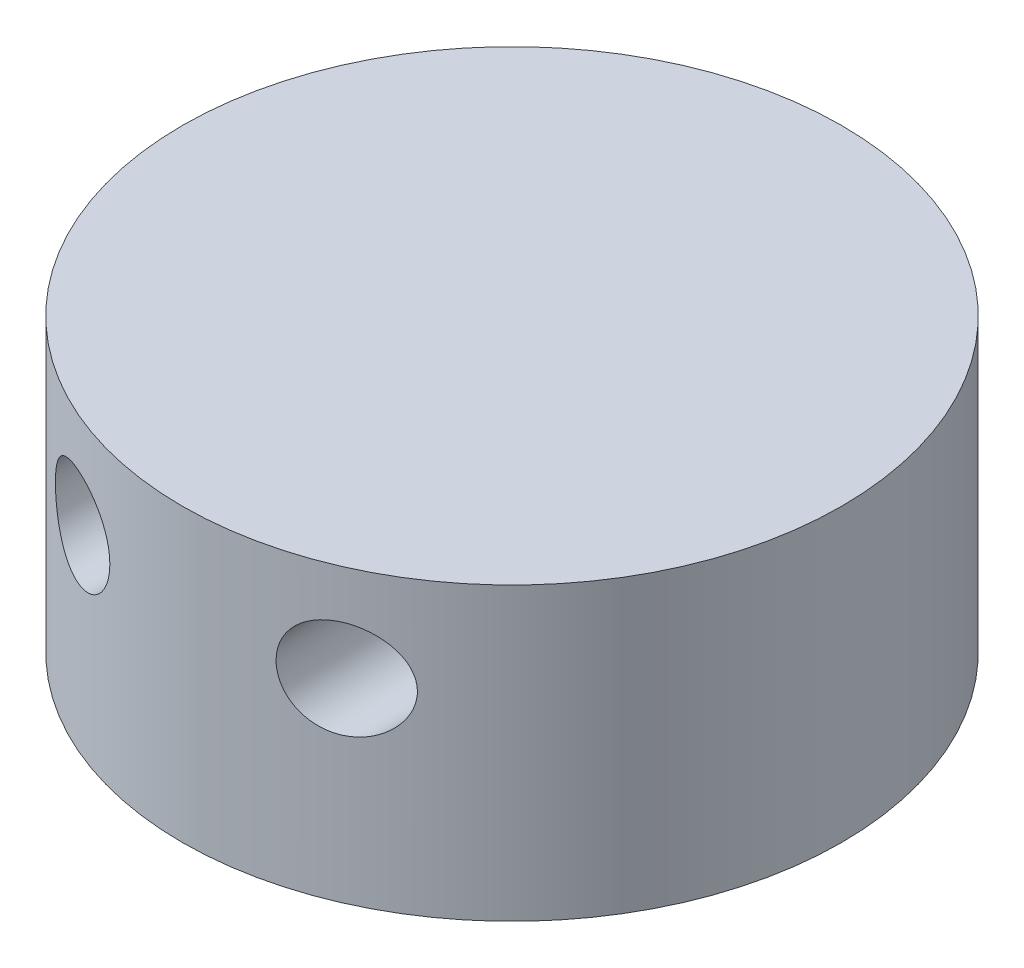
ISO-10303-21;
HEADER;
FILE_DESCRIPTION(('STEP AP214'),'2;1');
FILE_NAME('part.step','',(''),(''),'','','');
FILE_SCHEMA(('AUTOMOTIVE_DESIGN { 1 0 10303 214 1 1 1 1 }'));
ENDSEC;
DATA;
#1=APPLICATION_CONTEXT('core data for automotive mechanical design processes');
#2=APPLICATION_PROTOCOL_DEFINITION('international standard','automotive_design',2000,#1);
#3=PRODUCT_CONTEXT('',#1,'mechanical');
#4=PRODUCT('Part','Part','',(#3));
#5=PRODUCT_RELATED_PRODUCT_CATEGORY('part','',(#4));
#6=PRODUCT_DEFINITION_FORMATION('','',#4);
#7=PRODUCT_DEFINITION_CONTEXT('part definition',#1,'design');
#8=PRODUCT_DEFINITION('design','',#6,#7);
#9=PRODUCT_DEFINITION_SHAPE('','',#8);
#10=(LENGTH_UNIT() NAMED_UNIT(*) SI_UNIT(.MILLI.,.METRE.));
#11=(NAMED_UNIT(*) PLANE_ANGLE_UNIT() SI_UNIT($,.RADIAN.));
#12=(NAMED_UNIT(*) SI_UNIT($,.STERADIAN.) SOLID_ANGLE_UNIT());
#13=UNCERTAINTY_MEASURE_WITH_UNIT(LENGTH_MEASURE(1.E-05),#10,'distance_accuracy_value','');
#14=(GEOMETRIC_REPRESENTATION_CONTEXT(3) GLOBAL_UNCERTAINTY_ASSIGNED_CONTEXT((#13)) GLOBAL_UNIT_ASSIGNED_CONTEXT((#10,
#11,#12)) REPRESENTATION_CONTEXT('',''));
#15=CARTESIAN_POINT('',(0.,0.,0.));
#16=DIRECTION('',(0.,0.,1.));
#17=DIRECTION('',(1.,0.,0.));
#18=AXIS2_PLACEMENT_3D('',#15,#16,#17);
#19=CARTESIAN_POINT('',(0.,-19.05,0.));
#20=DIRECTION('',(0.,1.,0.));
#21=DIRECTION('',(0.,0.,1.));
#22=AXIS2_PLACEMENT_3D('',#19,#20,#21);
#23=CYLINDRICAL_SURFACE('',#22,21.5646);
#24=CARTESIAN_POINT('',(-11.8375244788466,-6.35,-18.0251210085455));
#25=CARTESIAN_POINT('',(-11.8375183473624,-6.51018114216781,-18.0251263162348));
#26=CARTESIAN_POINT('',(-11.8254290880868,-6.6704137015662,-18.0330820790892));
#27=CARTESIAN_POINT('',(-11.7777850103847,-6.98585035433216,-18.0642332893516));
#28=CARTESIAN_POINT('',(-11.7422144072352,-7.14105099144283,-18.0874389880853));
#29=CARTESIAN_POINT('',(-11.6497562099748,-7.44142680818182,-18.1471246719633));
#30=CARTESIAN_POINT('',(-11.5929604920097,-7.5866420488448,-18.1835474256552));
#31=CARTESIAN_POINT('',(-11.4605634840516,-7.86476139569148,-18.2672814389251));
#32=CARTESIAN_POINT('',(-11.3849578630624,-7.99766265688539,-18.3145952059805));
#33=CARTESIAN_POINT('',(-11.2113110386347,-8.25852501951614,-18.421443957742));
#34=CARTESIAN_POINT('',(-11.112019761268,-8.38538430582568,-18.4816260108911));
#35=CARTESIAN_POINT('',(-10.8977010507736,-8.62106980196782,-18.6088051328418));
#36=CARTESIAN_POINT('',(-10.7826665603868,-8.72988787575553,-18.6758052545265));
#37=CARTESIAN_POINT('',(-10.5207943879099,-8.94366894462049,-18.8247399152261));
#38=CARTESIAN_POINT('',(-10.3717849637708,-9.0454806960261,-18.9073888948592));
#39=CARTESIAN_POINT('',(-10.0598907459932,-9.222364217516,-19.0751665797716));
#40=CARTESIAN_POINT('',(-9.89699786600378,-9.29742027016151,-19.1602967109285));
#41=CARTESIAN_POINT('',(-9.54434429888561,-9.42539040894322,-19.3385660089982));
#42=CARTESIAN_POINT('',(-9.35351360338981,-9.47542392867096,-19.4316748642965));
#43=CARTESIAN_POINT('',(-8.9642043947241,-9.53974930770958,-19.6143121251587));
#44=CARTESIAN_POINT('',(-8.76572511354421,-9.55403756822131,-19.7038401693171));
#45=CARTESIAN_POINT('',(-8.36692464727601,-9.54519600880489,-19.8764605483672));
#46=CARTESIAN_POINT('',(-8.16660526111179,-9.5220995207692,-19.9595585470267));
#47=CARTESIAN_POINT('',(-7.77065834449357,-9.43750996116071,-20.117012182636));
#48=CARTESIAN_POINT('',(-7.57502872809517,-9.37603430195839,-20.1913717659769));
#49=CARTESIAN_POINT('',(-7.20927489895007,-9.22062720154446,-20.3247045929858));
#50=CARTESIAN_POINT('',(-7.03832333883191,-9.1292564194137,-20.3843889990063));
#51=CARTESIAN_POINT('',(-6.71361514487239,-8.91523323045435,-20.4936256376209));
#52=CARTESIAN_POINT('',(-6.55985033130298,-8.79259579640629,-20.543182699528));
#53=CARTESIAN_POINT('',(-6.28651512699416,-8.52955728883257,-20.628396044537));
#54=CARTESIAN_POINT('',(-6.16525101480595,-8.39115922178523,-20.6648126910791));
#55=CARTESIAN_POINT('',(-5.94750082426833,-8.09423219136849,-20.7285338223231));
#56=CARTESIAN_POINT('',(-5.85100791629074,-7.93570879477398,-20.7558408192547));
#57=CARTESIAN_POINT('',(-5.69023921086854,-7.61086792469432,-20.8004766181142));
#58=CARTESIAN_POINT('',(-5.62470452053309,-7.44522644209332,-20.818200587112));
#59=CARTESIAN_POINT('',(-5.52192017765209,-7.10476317342352,-20.8457004608132));
#60=CARTESIAN_POINT('',(-5.48466697619415,-6.92994254214792,-20.8554773627679));
#61=CARTESIAN_POINT('',(-5.4401871429484,-6.57964803138163,-20.8671238883316));
#62=CARTESIAN_POINT('',(-5.4324049343745,-6.40424929700857,-20.8691398310516));
#63=CARTESIAN_POINT('',(-5.44558781138506,-6.05461358068219,-20.8657037234144));
#64=CARTESIAN_POINT('',(-5.46655151317064,-5.8803765432117,-20.8602520325415));
#65=CARTESIAN_POINT('',(-5.53635732504388,-5.53879001557082,-20.8418329263995));
#66=CARTESIAN_POINT('',(-5.58507801477574,-5.37141390894487,-20.8288982410085));
#67=CARTESIAN_POINT('',(-5.70865313142634,-5.04743564743358,-20.795367872532));
#68=CARTESIAN_POINT('',(-5.78350725162901,-4.89083336612663,-20.7747722793589));
#69=CARTESIAN_POINT('',(-5.95732890248189,-4.59177881227504,-20.7255971033535));
#70=CARTESIAN_POINT('',(-6.05643512177475,-4.44941480515269,-20.6969714567415));
#71=CARTESIAN_POINT('',(-6.2751760926222,-4.18357489495717,-20.6317020948896));
#72=CARTESIAN_POINT('',(-6.39481183060543,-4.06009990002696,-20.5950579943455));
#73=CARTESIAN_POINT('',(-6.65331568789005,-3.83259832398677,-20.5130223155282));
#74=CARTESIAN_POINT('',(-6.79252779900094,-3.72902233412902,-20.4674668111612));
#75=CARTESIAN_POINT('',(-7.08374016275367,-3.54659145187776,-20.3685109548662));
#76=CARTESIAN_POINT('',(-7.23574252369343,-3.46774064525744,-20.3151093085222));
#77=CARTESIAN_POINT('',(-7.55488028036876,-3.33294608295785,-20.198658965099));
#78=CARTESIAN_POINT('',(-7.72238718335797,-3.27816171262923,-20.1352893791017));
#79=CARTESIAN_POINT('',(-8.06155617263523,-3.19695034675592,-20.0019131242545));
#80=CARTESIAN_POINT('',(-8.23321949760546,-3.17053191379108,-19.9319044582596));
#81=CARTESIAN_POINT('',(-8.58820427667065,-3.14469475758145,-19.7816669652899));
#82=CARTESIAN_POINT('',(-8.77151253388783,-3.14726560393889,-19.7010662437147));
#83=CARTESIAN_POINT('',(-9.13331087477277,-3.18307062733427,-19.5359722707738));
#84=CARTESIAN_POINT('',(-9.31179926529981,-3.21631543904604,-19.4514776790551));
#85=CARTESIAN_POINT('',(-9.67267672594903,-3.31557813375345,-19.2747118885559));
#86=CARTESIAN_POINT('',(-9.85440242858597,-3.38380744463464,-19.1823226429499));
#87=CARTESIAN_POINT('',(-10.2033427670218,-3.55230590079688,-18.999017700023));
#88=CARTESIAN_POINT('',(-10.3705475618737,-3.6525965621568,-18.9081030354542));
#89=CARTESIAN_POINT('',(-10.6897538025191,-3.88638885668287,-18.7295326301726));
#90=CARTESIAN_POINT('',(-10.8412808844119,-4.0206457928581,-18.64201180498));
#91=CARTESIAN_POINT('',(-11.1187864602791,-4.31892452796342,-18.4778391489687));
#92=CARTESIAN_POINT('',(-11.2447981737252,-4.48290709152432,-18.401173225369));
#93=CARTESIAN_POINT('',(-11.4387569506312,-4.7947979294923,-18.2810449825959));
#94=CARTESIAN_POINT('',(-11.513384256165,-4.93720176798187,-18.2340251022935));
#95=CARTESIAN_POINT('',(-11.64121897854,-5.23462211295067,-18.1526790865966));
#96=CARTESIAN_POINT('',(-11.6944584799594,-5.38961930455405,-18.1183339437398));
#97=CARTESIAN_POINT('',(-11.7691535818226,-5.67852229148266,-18.0698807910714));
#98=CARTESIAN_POINT('',(-11.7946920272404,-5.81094901118763,-18.0531888377708));
#99=CARTESIAN_POINT('',(-11.8288800385728,-6.0789048854612,-18.0308067212012));
#100=CARTESIAN_POINT('',(-11.8375296681005,-6.21443402834235,-18.0251165164933));
#101=CARTESIAN_POINT('',(-11.8375244788466,-6.35,-18.0251210085455));
#102=B_SPLINE_CURVE_WITH_KNOTS('',3,(#24,#25,#26,#27,#28,#29,#30,#31,#32,#33,#34,#35,#36,#37,
#38,#39,#40,#41,#42,#43,#44,#45,#46,#47,#48,#49,#50,#51,#52,#53,#54,#55,#56,#57,#58,#59,#60,#61,
#62,#63,#64,#65,#66,#67,#68,#69,#70,#71,#72,#73,#74,#75,#76,#77,#78,#79,#80,#81,#82,#83,#84,#85,
#86,#87,#88,#89,#90,#91,#92,#93,#94,#95,#96,#97,#98,#99,#100,#101),.UNSPECIFIED.,.T.,.F.,(4,2,2,
2,2,2,2,2,2,2,2,2,2,2,2,2,2,2,2,2,2,2,2,2,2,2,2,2,2,2,2,2,2,2,2,2,2,2,4),(0.,0.480002840177778,
0.960328678816137,1.43859899326639,1.91697953194483,2.43092468857725,2.94510099227822,
3.53814110966525,4.13152903223726,4.78290489082352,5.43434632668095,6.08520726330636,
6.73577312310645,7.34099713061964,7.94593185481078,8.50581662153068,9.06554685714912,
9.59998161328423,10.1343492945994,10.6585916232464,11.1828087162872,11.7047500869126,
12.2266853319579,12.7516780959175,13.2766960924698,13.8124771379264,14.3483466732274,
14.9077732785806,15.467368705764,16.0655910348174,16.6640208457133,17.3060536377057,
17.9485181997123,18.6067647856943,19.2641487844993,19.764636135949,20.2643698601019,
20.6706117912479,21.0768521922494),.UNSPECIFIED.);
#103=CARTESIAN_POINT('',(-11.8375244788466,-6.35,-18.0251210085455));
#104=VERTEX_POINT('',#103);
#105=EDGE_CURVE('E81',#104,#104,#102,.T.);
#106=ORIENTED_EDGE('',*,*,#105,.T.);
#107=EDGE_LOOP('',(#106));
#108=FACE_BOUND('',#107,.T.);
#109=CARTESIAN_POINT('',(5.43672447884657,-6.35,-20.8680138034531));
#110=CARTESIAN_POINT('',(5.43672863843616,-6.52483477192147,-20.8680137999827));
#111=CARTESIAN_POINT('',(5.45109778871426,-6.69971801194908,-20.8642852686758));
#112=CARTESIAN_POINT('',(5.50810780577915,-7.04453673724938,-20.8493061077241));
#113=CARTESIAN_POINT('',(5.55076183177466,-7.21446988111427,-20.8380519768614));
#114=CARTESIAN_POINT('',(5.66286249983721,-7.54443026140619,-20.8078664547761));
#115=CARTESIAN_POINT('',(5.73229487724811,-7.70446271928667,-20.7889391507296));
#116=CARTESIAN_POINT('',(5.89557564374538,-8.01027627256659,-20.7432233239564));
#117=CARTESIAN_POINT('',(5.98942167202279,-8.15605874407072,-20.7164355613068));
#118=CARTESIAN_POINT('',(6.19918610403369,-8.43064888865893,-20.6546380678828));
#119=CARTESIAN_POINT('',(6.31527228153835,-8.55931405611139,-20.6195653360657));
#120=CARTESIAN_POINT('',(6.56514225219469,-8.79519555257864,-20.5413726283791));
#121=CARTESIAN_POINT('',(6.69892768125634,-8.9024098966283,-20.498251908497));
#122=CARTESIAN_POINT('',(6.98396411328113,-9.09593116226537,-20.4029263199978));
#123=CARTESIAN_POINT('',(7.13560587764997,-9.18155056643083,-20.3504964588946));
#124=CARTESIAN_POINT('',(7.44836749065531,-9.32643169121543,-20.2381178737371));
#125=CARTESIAN_POINT('',(7.60948944574081,-9.38568752875535,-20.1781674752833));
#126=CARTESIAN_POINT('',(7.94559717724693,-9.4799273423008,-20.0482822802746));
#127=CARTESIAN_POINT('',(8.12086017230735,-9.51341427015758,-19.9779816009462));
#128=CARTESIAN_POINT('',(8.47209489744543,-9.5510243776635,-19.8315867805999));
#129=CARTESIAN_POINT('',(8.64806684383509,-9.5551377884757,-19.7554907206979));
#130=CARTESIAN_POINT('',(9.00957781620803,-9.53418281859575,-19.5934060356599));
#131=CARTESIAN_POINT('',(9.19484851226507,-9.5069097326406,-19.5071031518188));
#132=CARTESIAN_POINT('',(9.55691918280428,-9.42102564369968,-19.332298246801));
#133=CARTESIAN_POINT('',(9.73371571574798,-9.36240202414388,-19.2437953539448));
#134=CARTESIAN_POINT('',(10.0853785025826,-9.21076856261285,-19.0619683493968));
#135=CARTESIAN_POINT('',(10.2594514468719,-9.11585893132792,-18.9686839890133));
#136=CARTESIAN_POINT('',(10.588892596711,-8.89413965851005,-18.786771820638));
#137=CARTESIAN_POINT('',(10.7442507598291,-8.76731300192276,-18.6981465269695));
#138=CARTESIAN_POINT('',(11.0293271725212,-8.485300394095,-18.5314008991164));
#139=CARTESIAN_POINT('',(11.1593470978582,-8.33049667358566,-18.4531610253752));
#140=CARTESIAN_POINT('',(11.3323240987866,-8.07882580220031,-18.3470713167331));
#141=CARTESIAN_POINT('',(11.3862958311918,-7.99171786500841,-18.3135940719353));
#142=CARTESIAN_POINT('',(11.4861864803373,-7.81151012534235,-18.2511081087667));
#143=CARTESIAN_POINT('',(11.5321085103271,-7.71841265846715,-18.2220976633766));
#144=CARTESIAN_POINT('',(11.6345005352118,-7.48212376338512,-18.15697141332));
#145=CARTESIAN_POINT('',(11.6858908561939,-7.33583114748197,-18.1238583833418));
#146=CARTESIAN_POINT('',(11.7671978791586,-7.03515050002659,-18.0711761020631));
#147=CARTESIAN_POINT('',(11.7971318322131,-6.88076907934949,-18.0515959706703));
#148=CARTESIAN_POINT('',(11.8340159001715,-6.56761498868533,-18.0274387949528));
#149=CARTESIAN_POINT('',(11.8408981305433,-6.40883073481888,-18.0229060637469));
#150=CARTESIAN_POINT('',(11.8310610315065,-6.09231056783603,-18.0293649059119));
#151=CARTESIAN_POINT('',(11.8143399939684,-5.93457473142187,-18.0403576028325));
#152=CARTESIAN_POINT('',(11.75958219188,-5.63210824395645,-18.0760942073629));
#153=CARTESIAN_POINT('',(11.7225577198315,-5.48711288918131,-18.1001846323181));
#154=CARTESIAN_POINT('',(11.6296903133937,-5.20585749333075,-18.1599919315049));
#155=CARTESIAN_POINT('',(11.5738434387572,-5.06959928838881,-18.1957112400524));
#156=CARTESIAN_POINT('',(11.4409036643189,-4.79896460515389,-18.2796137614637));
#157=CARTESIAN_POINT('',(11.3625786636754,-4.66541686342428,-18.328504712593));
#158=CARTESIAN_POINT('',(11.1895060493381,-4.41316208827858,-18.4346747981152));
#159=CARTESIAN_POINT('',(11.0947505504092,-4.29446222787654,-18.4919579579944));
#160=CARTESIAN_POINT('',(10.8764208114197,-4.05701620914727,-18.6213254825123));
#161=CARTESIAN_POINT('',(10.750658841076,-3.94079356656855,-18.6943497713702));
#162=CARTESIAN_POINT('',(10.484101711613,-3.73082810773793,-18.8451339351665));
#163=CARTESIAN_POINT('',(10.3432976646482,-3.6370986893166,-18.9228965980596));
#164=CARTESIAN_POINT('',(10.0302172695138,-3.46243013000323,-19.0908936084501));
#165=CARTESIAN_POINT('',(9.85623897747556,-3.38480603641221,-19.1814206561924));
#166=CARTESIAN_POINT('',(9.49695487129407,-3.26141590403389,-19.3618249325463));
#167=CARTESIAN_POINT('',(9.31164484958532,-3.21566177792721,-19.4517019057574));
#168=CARTESIAN_POINT('',(8.92549444926128,-3.15637196636182,-19.6319868586928));
#169=CARTESIAN_POINT('',(8.72433145053246,-3.14440676062499,-19.722230861707));
#170=CARTESIAN_POINT('',(8.3204405655901,-3.15890808233346,-19.8959927175707));
#171=CARTESIAN_POINT('',(8.11771306430111,-3.18536543856206,-19.979512170505));
#172=CARTESIAN_POINT('',(7.72678291728177,-3.27555332196793,-20.1338264056452));
#173=CARTESIAN_POINT('',(7.53833921445923,-3.33753186187906,-20.2050274200308));
#174=CARTESIAN_POINT('',(7.1733453942483,-3.49701805579532,-20.3374716231719));
#175=CARTESIAN_POINT('',(6.99678887056148,-3.59450638812007,-20.3987202011134));
#176=CARTESIAN_POINT('',(6.67615770050994,-3.81388565892211,-20.5057856934174));
#177=CARTESIAN_POINT('',(6.5306174365783,-3.93322771615437,-20.5524412780331));
#178=CARTESIAN_POINT('',(6.26140705491996,-4.1973188704733,-20.6360522860841));
#179=CARTESIAN_POINT('',(6.1377310949971,-4.34206115989471,-20.6730103020159));
#180=CARTESIAN_POINT('',(5.92385838278072,-4.6432992013847,-20.7352738004986));
#181=CARTESIAN_POINT('',(5.83210087717488,-4.79857298749189,-20.7611443154265));
#182=CARTESIAN_POINT('',(5.6757018003019,-5.12323731417506,-20.8044468642108));
#183=CARTESIAN_POINT('',(5.61104133791416,-5.29261792087788,-20.8218847782945));
#184=CARTESIAN_POINT('',(5.51997117208902,-5.60963605513495,-20.8461910759089));
#185=CARTESIAN_POINT('',(5.48882398721867,-5.75583331343043,-20.8543819062335));
#186=CARTESIAN_POINT('',(5.44719929282166,-6.05134201198158,-20.8652931579973));
#187=CARTESIAN_POINT('',(5.43672092565817,-6.20065332276219,-20.8680138064177));
#188=CARTESIAN_POINT('',(5.43672447884657,-6.35,-20.8680138034531));
#189=B_SPLINE_CURVE_WITH_KNOTS('',3,(#109,#110,#111,#112,#113,#114,#115,#116,#117,#118,#119,
#120,#121,#122,#123,#124,#125,#126,#127,#128,#129,#130,#131,#132,#133,#134,#135,#136,#137,#138,
#139,#140,#141,#142,#143,#144,#145,#146,#147,#148,#149,#150,#151,#152,#153,#154,#155,#156,#157,
#158,#159,#160,#161,#162,#163,#164,#165,#166,#167,#168,#169,#170,#171,#172,#173,#174,#175,#176,
#177,#178,#179,#180,#181,#182,#183,#184,#185,#186,#187,#188),.UNSPECIFIED.,.T.,.F.,(4,2,2,2,2,2,
2,2,2,2,2,2,2,2,2,2,2,2,2,2,2,2,2,2,2,2,2,2,2,2,2,2,2,2,2,2,2,2,2,4),(0.,0.5239645837294,
1.048173107059,1.57210277270005,2.09598179297149,2.62398060506208,3.1520282532728,
3.69521453500309,4.23852196904689,4.81140830959355,5.38448516776553,6.00040687587619,
6.61657663952862,7.270794332266,7.92536153182041,8.57158232693742,8.89451555900404,
9.21732361866269,9.69078802533241,10.1638713349687,10.6383465985064,11.1128562007987,
11.5656133781747,12.018465393838,12.5036455764102,12.9890592517284,13.5453442915631,
14.1019598583244,14.7319535728188,15.3621826465855,16.0212571613707,16.6801743851926,
17.3090895436673,17.9376630051478,18.5163795513678,19.0949412286017,19.6388749730776,
20.1824288723605,20.6300264293896,21.0776054133084),.UNSPECIFIED.);
#190=CARTESIAN_POINT('',(5.43672447884657,-6.35,-20.8680138034531));
#191=VERTEX_POINT('',#190);
#192=EDGE_CURVE('E50',#191,#191,#189,.T.);
#193=ORIENTED_EDGE('',*,*,#192,.T.);
#194=EDGE_LOOP('',(#193));
#195=FACE_BOUND('',#194,.T.);
#196=CARTESIAN_POINT('',(0.,-19.05,0.));
#197=DIRECTION('',(0.,1.,0.));
#198=DIRECTION('',(0.,0.,1.));
#199=AXIS2_PLACEMENT_3D('',#196,#197,#198);
#200=CIRCLE('',#199,21.5646);
#201=CARTESIAN_POINT('',(0.,-19.05,21.5646));
#202=VERTEX_POINT('',#201);
#203=EDGE_CURVE('E10',#202,#202,#200,.T.);
#204=ORIENTED_EDGE('',*,*,#203,.T.);
#205=EDGE_LOOP('',(#204));
#206=FACE_BOUND('',#205,.T.);
#207=CARTESIAN_POINT('',(0.,0.,0.));
#208=DIRECTION('',(0.,1.,0.));
#209=DIRECTION('',(0.,0.,1.));
#210=AXIS2_PLACEMENT_3D('',#207,#208,#209);
#211=CIRCLE('',#210,21.5646);
#212=CARTESIAN_POINT('',(0.,0.,21.5646));
#213=VERTEX_POINT('',#212);
#214=EDGE_CURVE('E42',#213,#213,#211,.T.);
#215=ORIENTED_EDGE('',*,*,#214,.F.);
#216=EDGE_LOOP('',(#215));
#217=FACE_BOUND('',#216,.T.);
#218=CARTESIAN_POINT('',(5.43672447884657,-6.35,20.8680138034531));
#219=CARTESIAN_POINT('',(5.43672863843616,-6.17516522807854,20.8680137999827));
#220=CARTESIAN_POINT('',(5.45109778871426,-6.00028198805093,20.8642852686758));
#221=CARTESIAN_POINT('',(5.50810780577915,-5.65546326275063,20.8493061077241));
#222=CARTESIAN_POINT('',(5.55076183177466,-5.48553011888574,20.8380519768614));
#223=CARTESIAN_POINT('',(5.66286249983721,-5.15556973859382,20.8078664547761));
#224=CARTESIAN_POINT('',(5.73229487724811,-4.99553728071334,20.7889391507296));
#225=CARTESIAN_POINT('',(5.89557564374538,-4.68972372743341,20.7432233239564));
#226=CARTESIAN_POINT('',(5.98942167202279,-4.54394125592929,20.7164355613068));
#227=CARTESIAN_POINT('',(6.19918610403369,-4.26935111134107,20.6546380678828));
#228=CARTESIAN_POINT('',(6.31527228153835,-4.14068594388862,20.6195653360657));
#229=CARTESIAN_POINT('',(6.56514225219469,-3.90480444742137,20.5413726283791));
#230=CARTESIAN_POINT('',(6.69892768125634,-3.79759010337171,20.498251908497));
#231=CARTESIAN_POINT('',(6.98396411328113,-3.60406883773464,20.4029263199978));
#232=CARTESIAN_POINT('',(7.13560587764997,-3.51844943356918,20.3504964588946));
#233=CARTESIAN_POINT('',(7.44836749065531,-3.37356830878458,20.2381178737371));
#234=CARTESIAN_POINT('',(7.60948944574081,-3.31431247124466,20.1781674752833));
#235=CARTESIAN_POINT('',(7.94559717724693,-3.22007265769921,20.0482822802746));
#236=CARTESIAN_POINT('',(8.12086017230735,-3.18658572984242,19.9779816009462));
#237=CARTESIAN_POINT('',(8.47209489744543,-3.1489756223365,19.8315867805999));
#238=CARTESIAN_POINT('',(8.64806684383509,-3.14486221152431,19.7554907206979));
#239=CARTESIAN_POINT('',(9.00957781620803,-3.16581718140425,19.5934060356599));
#240=CARTESIAN_POINT('',(9.19484851226507,-3.19309026735941,19.5071031518188));
#241=CARTESIAN_POINT('',(9.55691918280428,-3.27897435630033,19.332298246801));
#242=CARTESIAN_POINT('',(9.73371571574798,-3.33759797585612,19.2437953539448));
#243=CARTESIAN_POINT('',(10.0853785025826,-3.48923143738716,19.0619683493968));
#244=CARTESIAN_POINT('',(10.2594514468719,-3.58414106867209,18.9686839890133));
#245=CARTESIAN_POINT('',(10.588892596711,-3.80586034148996,18.786771820638));
#246=CARTESIAN_POINT('',(10.7442507598291,-3.93268699807724,18.6981465269695));
#247=CARTESIAN_POINT('',(11.0293271725212,-4.21469960590501,18.5314008991164));
#248=CARTESIAN_POINT('',(11.1593470978582,-4.36950332641435,18.4531610253752));
#249=CARTESIAN_POINT('',(11.3323240987866,-4.6211741977997,18.3470713167331));
#250=CARTESIAN_POINT('',(11.3862958311918,-4.7082821349916,18.3135940719353));
#251=CARTESIAN_POINT('',(11.4861864803373,-4.88848987465766,18.2511081087667));
#252=CARTESIAN_POINT('',(11.5321085103271,-4.98158734153285,18.2220976633766));
#253=CARTESIAN_POINT('',(11.6345005352118,-5.21787623661489,18.15697141332));
#254=CARTESIAN_POINT('',(11.6858908561939,-5.36416885251804,18.1238583833418));
#255=CARTESIAN_POINT('',(11.7671978791586,-5.66484949997341,18.0711761020631));
#256=CARTESIAN_POINT('',(11.7971318322131,-5.81923092065052,18.0515959706703));
#257=CARTESIAN_POINT('',(11.8340159001715,-6.13238501131467,18.0274387949528));
#258=CARTESIAN_POINT('',(11.8408981305433,-6.29116926518112,18.0229060637469));
#259=CARTESIAN_POINT('',(11.8310610315065,-6.60768943216398,18.0293649059119));
#260=CARTESIAN_POINT('',(11.8143399939684,-6.76542526857813,18.0403576028325));
#261=CARTESIAN_POINT('',(11.75958219188,-7.06789175604356,18.0760942073629));
#262=CARTESIAN_POINT('',(11.7225577198315,-7.21288711081869,18.1001846323181));
#263=CARTESIAN_POINT('',(11.6296903133937,-7.49414250666926,18.1599919315049));
#264=CARTESIAN_POINT('',(11.5738434387572,-7.6304007116112,18.1957112400524));
#265=CARTESIAN_POINT('',(11.4409036643189,-7.90103539484612,18.2796137614637));
#266=CARTESIAN_POINT('',(11.3625786636754,-8.03458313657573,18.328504712593));
#267=CARTESIAN_POINT('',(11.1895060493381,-8.28683791172143,18.4346747981152));
#268=CARTESIAN_POINT('',(11.0947505504092,-8.40553777212346,18.4919579579944));
#269=CARTESIAN_POINT('',(10.8764208114197,-8.64298379085274,18.6213254825123));
#270=CARTESIAN_POINT('',(10.750658841076,-8.75920643343146,18.6943497713702));
#271=CARTESIAN_POINT('',(10.484101711613,-8.96917189226208,18.8451339351665));
#272=CARTESIAN_POINT('',(10.3432976646482,-9.06290131068341,18.9228965980596));
#273=CARTESIAN_POINT('',(10.0302172695138,-9.23756986999677,19.0908936084501));
#274=CARTESIAN_POINT('',(9.85623897747556,-9.3151939635878,19.1814206561924));
#275=CARTESIAN_POINT('',(9.49695487129407,-9.43858409596612,19.3618249325463));
#276=CARTESIAN_POINT('',(9.31164484958532,-9.48433822207279,19.4517019057574));
#277=CARTESIAN_POINT('',(8.92549444926128,-9.54362803363819,19.6319868586928));
#278=CARTESIAN_POINT('',(8.72433145053246,-9.55559323937502,19.722230861707));
#279=CARTESIAN_POINT('',(8.3204405655901,-9.54109191766655,19.8959927175707));
#280=CARTESIAN_POINT('',(8.11771306430111,-9.51463456143794,19.979512170505));
#281=CARTESIAN_POINT('',(7.72678291728177,-9.42444667803208,20.1338264056452));
#282=CARTESIAN_POINT('',(7.53833921445923,-9.36246813812095,20.2050274200308));
#283=CARTESIAN_POINT('',(7.17334539424831,-9.20298194420468,20.3374716231719));
#284=CARTESIAN_POINT('',(6.99678887056148,-9.10549361187994,20.3987202011134));
#285=CARTESIAN_POINT('',(6.67615770050994,-8.8861143410779,20.5057856934174));
#286=CARTESIAN_POINT('',(6.5306174365783,-8.76677228384564,20.5524412780331));
#287=CARTESIAN_POINT('',(6.26140705491996,-8.50268112952671,20.6360522860841));
#288=CARTESIAN_POINT('',(6.1377310949971,-8.3579388401053,20.6730103020159));
#289=CARTESIAN_POINT('',(5.92385838278072,-8.05670079861531,20.7352738004986));
#290=CARTESIAN_POINT('',(5.83210087717488,-7.90142701250811,20.7611443154265));
#291=CARTESIAN_POINT('',(5.6757018003019,-7.57676268582494,20.8044468642108));
#292=CARTESIAN_POINT('',(5.61104133791416,-7.40738207912212,20.8218847782945));
#293=CARTESIAN_POINT('',(5.51997117208902,-7.09036394486506,20.8461910759089));
#294=CARTESIAN_POINT('',(5.48882398721867,-6.94416668656958,20.8543819062335));
#295=CARTESIAN_POINT('',(5.44719929282166,-6.64865798801843,20.8652931579973));
#296=CARTESIAN_POINT('',(5.43672092565817,-6.49934667723781,20.8680138064177));
#297=CARTESIAN_POINT('',(5.43672447884657,-6.35,20.8680138034531));
#298=B_SPLINE_CURVE_WITH_KNOTS('',3,(#218,#219,#220,#221,#222,#223,#224,#225,#226,#227,#228,
#229,#230,#231,#232,#233,#234,#235,#236,#237,#238,#239,#240,#241,#242,#243,#244,#245,#246,#247,
#248,#249,#250,#251,#252,#253,#254,#255,#256,#257,#258,#259,#260,#261,#262,#263,#264,#265,#266,
#267,#268,#269,#270,#271,#272,#273,#274,#275,#276,#277,#278,#279,#280,#281,#282,#283,#284,#285,
#286,#287,#288,#289,#290,#291,#292,#293,#294,#295,#296,#297),.UNSPECIFIED.,.T.,.F.,(4,2,2,2,2,2,
2,2,2,2,2,2,2,2,2,2,2,2,2,2,2,2,2,2,2,2,2,2,2,2,2,2,2,2,2,2,2,2,2,4),(0.,0.5239645837294,
1.048173107059,1.57210277270004,2.0959817929715,2.62398060506208,3.1520282532728,
3.69521453500308,4.23852196904689,4.81140830959355,5.38448516776553,6.00040687587619,
6.61657663952862,7.270794332266,7.92536153182041,8.57158232693742,8.89451555900404,
9.2173236186627,9.69078802533241,10.1638713349687,10.6383465985064,11.1128562007987,
11.5656133781747,12.018465393838,12.5036455764102,12.9890592517284,13.5453442915631,
14.1019598583244,14.7319535728188,15.3621826465855,16.0212571613707,16.6801743851926,
17.3090895436673,17.9376630051478,18.5163795513678,19.0949412286017,19.6388749730776,
20.1824288723605,20.6300264293896,21.0776054133084),.UNSPECIFIED.);
#299=CARTESIAN_POINT('',(5.43672447884657,-6.35,20.8680138034531));
#300=VERTEX_POINT('',#299);
#301=EDGE_CURVE('E47',#300,#300,#298,.T.);
#302=ORIENTED_EDGE('',*,*,#301,.T.);
#303=EDGE_LOOP('',(#302));
#304=FACE_BOUND('',#303,.T.);
#305=CARTESIAN_POINT('',(-11.8375244788466,-6.35,18.0251210085455));
#306=CARTESIAN_POINT('',(-11.8375183473624,-6.1898188578322,18.0251263162348));
#307=CARTESIAN_POINT('',(-11.8254290880868,-6.02958629843381,18.0330820790892));
#308=CARTESIAN_POINT('',(-11.7777850103847,-5.71414964566785,18.0642332893516));
#309=CARTESIAN_POINT('',(-11.7422144072352,-5.55894900855718,18.0874389880853));
#310=CARTESIAN_POINT('',(-11.6497562099748,-5.25857319181819,18.1471246719633));
#311=CARTESIAN_POINT('',(-11.5929604920097,-5.11335795115521,18.1835474256552));
#312=CARTESIAN_POINT('',(-11.4605634840516,-4.83523860430853,18.2672814389251));
#313=CARTESIAN_POINT('',(-11.3849578630624,-4.70233734311462,18.3145952059805));
#314=CARTESIAN_POINT('',(-11.2113110386347,-4.44147498048387,18.421443957742));
#315=CARTESIAN_POINT('',(-11.112019761268,-4.31461569417433,18.4816260108911));
#316=CARTESIAN_POINT('',(-10.8977010507736,-4.07893019803219,18.6088051328418));
#317=CARTESIAN_POINT('',(-10.7826665603868,-3.97011212424448,18.6758052545265));
#318=CARTESIAN_POINT('',(-10.5207943879099,-3.75633105537952,18.8247399152261));
#319=CARTESIAN_POINT('',(-10.3717849637708,-3.65451930397391,18.9073888948592));
#320=CARTESIAN_POINT('',(-10.0598907459932,-3.47763578248401,19.0751665797716));
#321=CARTESIAN_POINT('',(-9.89699786600378,-3.4025797298385,19.1602967109285));
#322=CARTESIAN_POINT('',(-9.54434429888561,-3.27460959105679,19.3385660089982));
#323=CARTESIAN_POINT('',(-9.35351360338981,-3.22457607132905,19.4316748642965));
#324=CARTESIAN_POINT('',(-8.9642043947241,-3.16025069229043,19.6143121251587));
#325=CARTESIAN_POINT('',(-8.76572511354421,-3.1459624317787,19.7038401693171));
#326=CARTESIAN_POINT('',(-8.36692464727601,-3.15480399119512,19.8764605483672));
#327=CARTESIAN_POINT('',(-8.16660526111178,-3.17790047923081,19.9595585470267));
#328=CARTESIAN_POINT('',(-7.77065834449357,-3.2624900388393,20.117012182636));
#329=CARTESIAN_POINT('',(-7.57502872809517,-3.32396569804162,20.1913717659769));
#330=CARTESIAN_POINT('',(-7.20927489895006,-3.47937279845555,20.3247045929858));
#331=CARTESIAN_POINT('',(-7.03832333883191,-3.57074358058631,20.3843889990063));
#332=CARTESIAN_POINT('',(-6.71361514487239,-3.78476676954566,20.4936256376209));
#333=CARTESIAN_POINT('',(-6.55985033130298,-3.90740420359372,20.543182699528));
#334=CARTESIAN_POINT('',(-6.28651512699416,-4.17044271116744,20.628396044537));
#335=CARTESIAN_POINT('',(-6.16525101480595,-4.30884077821478,20.6648126910791));
#336=CARTESIAN_POINT('',(-5.94750082426833,-4.60576780863152,20.7285338223231));
#337=CARTESIAN_POINT('',(-5.85100791629074,-4.76429120522603,20.7558408192547));
#338=CARTESIAN_POINT('',(-5.69023921086854,-5.08913207530569,20.8004766181142));
#339=CARTESIAN_POINT('',(-5.62470452053309,-5.25477355790669,20.818200587112));
#340=CARTESIAN_POINT('',(-5.52192017765209,-5.59523682657649,20.8457004608132));
#341=CARTESIAN_POINT('',(-5.48466697619415,-5.7700574578521,20.8554773627679));
#342=CARTESIAN_POINT('',(-5.4401871429484,-6.12035196861838,20.8671238883316));
#343=CARTESIAN_POINT('',(-5.4324049343745,-6.29575070299144,20.8691398310516));
#344=CARTESIAN_POINT('',(-5.44558781138506,-6.64538641931782,20.8657037234144));
#345=CARTESIAN_POINT('',(-5.46655151317064,-6.81962345678831,20.8602520325415));
#346=CARTESIAN_POINT('',(-5.53635732504388,-7.16120998442919,20.8418329263995));
#347=CARTESIAN_POINT('',(-5.58507801477574,-7.32858609105514,20.8288982410085));
#348=CARTESIAN_POINT('',(-5.70865313142634,-7.65256435256643,20.795367872532));
#349=CARTESIAN_POINT('',(-5.78350725162901,-7.80916663387338,20.7747722793589));
#350=CARTESIAN_POINT('',(-5.95732890248189,-8.10822118772498,20.7255971033535));
#351=CARTESIAN_POINT('',(-6.05643512177475,-8.25058519484732,20.6969714567415));
#352=CARTESIAN_POINT('',(-6.2751760926222,-8.51642510504284,20.6317020948896));
#353=CARTESIAN_POINT('',(-6.39481183060543,-8.63990009997305,20.5950579943455));
#354=CARTESIAN_POINT('',(-6.65331568789005,-8.86740167601324,20.5130223155282));
#355=CARTESIAN_POINT('',(-6.79252779900094,-8.97097766587099,20.4674668111612));
#356=CARTESIAN_POINT('',(-7.08374016275367,-9.15340854812225,20.3685109548662));
#357=CARTESIAN_POINT('',(-7.23574252369343,-9.23225935474258,20.3151093085222));
#358=CARTESIAN_POINT('',(-7.55488028036877,-9.36705391704216,20.198658965099));
#359=CARTESIAN_POINT('',(-7.72238718335797,-9.42183828737078,20.1352893791017));
#360=CARTESIAN_POINT('',(-8.06155617263523,-9.50304965324409,20.0019131242545));
#361=CARTESIAN_POINT('',(-8.23321949760547,-9.52946808620893,19.9319044582596));
#362=CARTESIAN_POINT('',(-8.58820427667066,-9.55530524241856,19.7816669652899));
#363=CARTESIAN_POINT('',(-8.77151253388784,-9.55273439606112,19.7010662437147));
#364=CARTESIAN_POINT('',(-9.13331087477278,-9.51692937266574,19.5359722707738));
#365=CARTESIAN_POINT('',(-9.31179926529982,-9.48368456095397,19.451477679055));
#366=CARTESIAN_POINT('',(-9.67267672594904,-9.38442186624656,19.2747118885559));
#367=CARTESIAN_POINT('',(-9.85440242858598,-9.31619255536537,19.1823226429499));
#368=CARTESIAN_POINT('',(-10.2033427670219,-9.14769409920313,18.999017700023));
#369=CARTESIAN_POINT('',(-10.3705475618737,-9.04740343784321,18.9081030354542));
#370=CARTESIAN_POINT('',(-10.6897538025191,-8.81361114331714,18.7295326301726));
#371=CARTESIAN_POINT('',(-10.8412808844119,-8.67935420714191,18.64201180498));
#372=CARTESIAN_POINT('',(-11.1187864602791,-8.38107547203659,18.4778391489687));
#373=CARTESIAN_POINT('',(-11.2447981737252,-8.21709290847569,18.401173225369));
#374=CARTESIAN_POINT('',(-11.4387569506312,-7.9052020705077,18.2810449825959));
#375=CARTESIAN_POINT('',(-11.513384256165,-7.76279823201813,18.2340251022935));
#376=CARTESIAN_POINT('',(-11.64121897854,-7.46537788704933,18.1526790865966));
#377=CARTESIAN_POINT('',(-11.6944584799594,-7.31038069544596,18.1183339437398));
#378=CARTESIAN_POINT('',(-11.7691535818226,-7.02147770851734,18.0698807910714));
#379=CARTESIAN_POINT('',(-11.7946920272404,-6.88905098881238,18.0531888377708));
#380=CARTESIAN_POINT('',(-11.8288800385728,-6.62109511453881,18.0308067212012));
#381=CARTESIAN_POINT('',(-11.8375296681005,-6.48556597165766,18.0251165164933));
#382=CARTESIAN_POINT('',(-11.8375244788466,-6.35,18.0251210085455));
#383=B_SPLINE_CURVE_WITH_KNOTS('',3,(#305,#306,#307,#308,#309,#310,#311,#312,#313,#314,#315,
#316,#317,#318,#319,#320,#321,#322,#323,#324,#325,#326,#327,#328,#329,#330,#331,#332,#333,#334,
#335,#336,#337,#338,#339,#340,#341,#342,#343,#344,#345,#346,#347,#348,#349,#350,#351,#352,#353,
#354,#355,#356,#357,#358,#359,#360,#361,#362,#363,#364,#365,#366,#367,#368,#369,#370,#371,#372,
#373,#374,#375,#376,#377,#378,#379,#380,#381,#382),.UNSPECIFIED.,.T.,.F.,(4,2,2,2,2,2,2,2,2,2,2,
2,2,2,2,2,2,2,2,2,2,2,2,2,2,2,2,2,2,2,2,2,2,2,2,2,2,2,4),(0.,0.480002840177778,
0.960328678816138,1.4385989932664,1.91697953194483,2.43092468857725,2.94510099227822,
3.53814110966525,4.13152903223726,4.78290489082352,5.43434632668095,6.08520726330636,
6.73577312310645,7.34099713061964,7.94593185481078,8.50581662153068,9.06554685714913,
9.59998161328424,10.1343492945995,10.6585916232465,11.1828087162872,11.7047500869127,
12.2266853319579,12.7516780959175,13.2766960924698,13.8124771379264,14.3483466732274,
14.9077732785806,15.467368705764,16.0655910348174,16.6640208457133,17.3060536377057,
17.9485181997123,18.6067647856943,19.2641487844993,19.764636135949,20.2643698601019,
20.6706117912479,21.0768521922494),.UNSPECIFIED.);
#384=CARTESIAN_POINT('',(-11.8375244788466,-6.35,18.0251210085455));
#385=VERTEX_POINT('',#384);
#386=EDGE_CURVE('E35',#385,#385,#383,.T.);
#387=ORIENTED_EDGE('',*,*,#386,.T.);
#388=EDGE_LOOP('',(#387));
#389=FACE_BOUND('',#388,.T.);
#390=ADVANCED_FACE('F31',(#108,#195,#206,#217,#304,#389),#23,.T.);
#391=CARTESIAN_POINT('',(0.,-19.05,0.));
#392=DIRECTION('',(0.,1.,0.));
#393=DIRECTION('',(0.,0.,1.));
#394=AXIS2_PLACEMENT_3D('',#391,#392,#393);
#395=PLANE('',#394);
#396=ORIENTED_EDGE('',*,*,#203,.F.);
#397=EDGE_LOOP('',(#396));
#398=FACE_BOUND('',#397,.T.);
#399=ADVANCED_FACE('F66',(#398),#395,.F.);
#400=CARTESIAN_POINT('',(0.,0.,0.));
#401=DIRECTION('',(0.,1.,0.));
#402=DIRECTION('',(0.,0.,1.));
#403=AXIS2_PLACEMENT_3D('',#400,#401,#402);
#404=PLANE('',#403);
#405=ORIENTED_EDGE('',*,*,#214,.T.);
#406=EDGE_LOOP('',(#405));
#407=FACE_BOUND('',#406,.T.);
#408=ADVANCED_FACE('F63',(#407),#404,.T.);
#409=CARTESIAN_POINT('',(8.63712447884657,-6.35,21.5646));
#410=DIRECTION('',(0.,0.,-1.));
#411=DIRECTION('',(-1.,0.,0.));
#412=AXIS2_PLACEMENT_3D('',#409,#410,#411);
#413=CYLINDRICAL_SURFACE('',#412,3.2004);
#414=ORIENTED_EDGE('',*,*,#301,.F.);
#415=EDGE_LOOP('',(#414));
#416=FACE_BOUND('',#415,.T.);
#417=ORIENTED_EDGE('',*,*,#192,.F.);
#418=EDGE_LOOP('',(#417));
#419=FACE_BOUND('',#418,.T.);
#420=ADVANCED_FACE('F58',(#416,#419),#413,.F.);
#421=CARTESIAN_POINT('',(-8.63712447884657,-6.35,21.5646));
#422=DIRECTION('',(0.,0.,-1.));
#423=DIRECTION('',(-1.,0.,0.));
#424=AXIS2_PLACEMENT_3D('',#421,#422,#423);
#425=CYLINDRICAL_SURFACE('',#424,3.2004);
#426=ORIENTED_EDGE('',*,*,#386,.F.);
#427=EDGE_LOOP('',(#426));
#428=FACE_BOUND('',#427,.T.);
#429=ORIENTED_EDGE('',*,*,#105,.F.);
#430=EDGE_LOOP('',(#429));
#431=FACE_BOUND('',#430,.T.);
#432=ADVANCED_FACE('F62',(#428,#431),#425,.F.);
#433=CLOSED_SHELL('',(#390,#399,#408,#420,#432));
#434=MANIFOLD_SOLID_BREP('B2',#433);
#435=ADVANCED_BREP_SHAPE_REPRESENTATION('',(#18,#434),#14);
#436=SHAPE_DEFINITION_REPRESENTATION(#9,#435);
ENDSEC;
END-ISO-10303-21;
